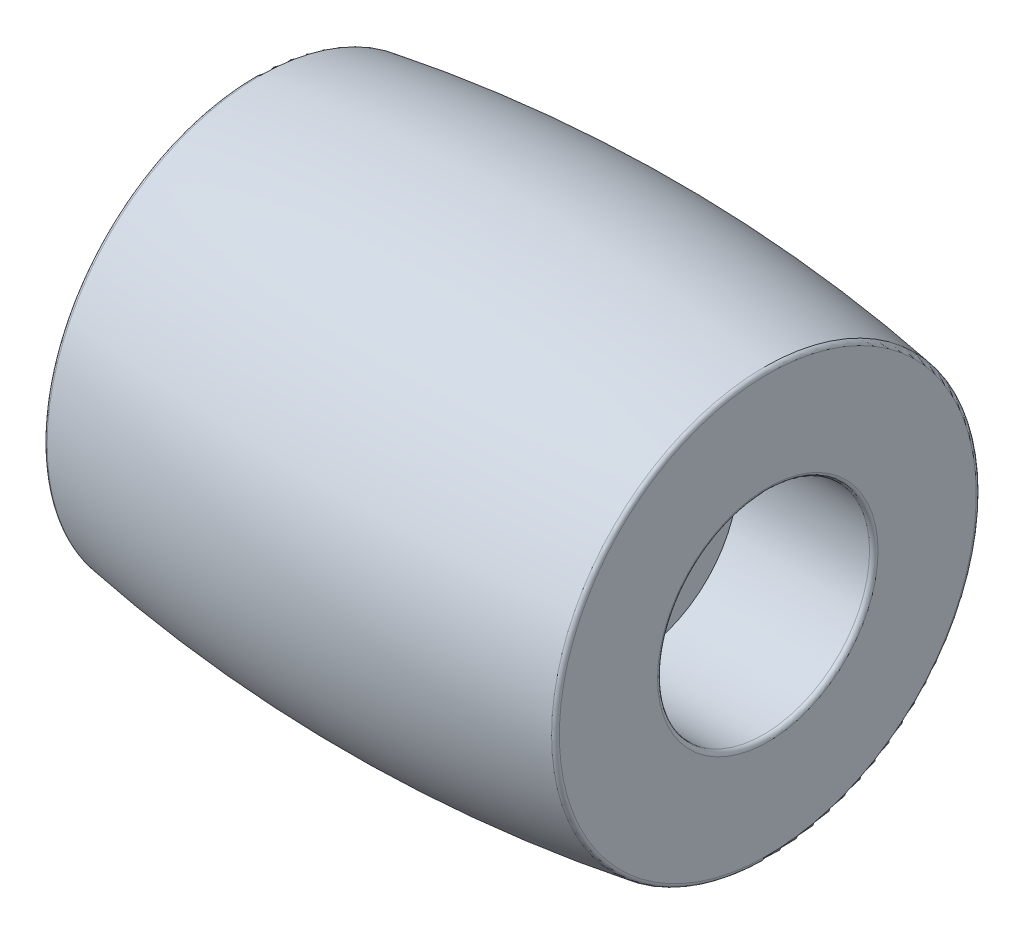
ISO-10303-21;
HEADER;
FILE_DESCRIPTION(('STEP AP214'),'2;1');
FILE_NAME('part.step','',(''),(''),'','','');
FILE_SCHEMA(('AUTOMOTIVE_DESIGN { 1 0 10303 214 1 1 1 1 }'));
ENDSEC;
DATA;
#1=APPLICATION_CONTEXT('core data for automotive mechanical design processes');
#2=APPLICATION_PROTOCOL_DEFINITION('international standard','automotive_design',2000,#1);
#3=PRODUCT_CONTEXT('',#1,'mechanical');
#4=PRODUCT('Part','Part','',(#3));
#5=PRODUCT_RELATED_PRODUCT_CATEGORY('part','',(#4));
#6=PRODUCT_DEFINITION_FORMATION('','',#4);
#7=PRODUCT_DEFINITION_CONTEXT('part definition',#1,'design');
#8=PRODUCT_DEFINITION('design','',#6,#7);
#9=PRODUCT_DEFINITION_SHAPE('','',#8);
#10=(LENGTH_UNIT() NAMED_UNIT(*) SI_UNIT(.MILLI.,.METRE.));
#11=(NAMED_UNIT(*) PLANE_ANGLE_UNIT() SI_UNIT($,.RADIAN.));
#12=(NAMED_UNIT(*) SI_UNIT($,.STERADIAN.) SOLID_ANGLE_UNIT());
#13=UNCERTAINTY_MEASURE_WITH_UNIT(LENGTH_MEASURE(1.E-05),#10,'distance_accuracy_value','');
#14=(GEOMETRIC_REPRESENTATION_CONTEXT(3) GLOBAL_UNCERTAINTY_ASSIGNED_CONTEXT((#13)) GLOBAL_UNIT_ASSIGNED_CONTEXT((#10,
#11,#12)) REPRESENTATION_CONTEXT('',''));
#15=CARTESIAN_POINT('',(0.,0.,0.));
#16=DIRECTION('',(0.,0.,1.));
#17=DIRECTION('',(1.,0.,0.));
#18=AXIS2_PLACEMENT_3D('',#15,#16,#17);
#19=CARTESIAN_POINT('',(-6.03383220595554,32.0092181245626,22.));
#20=DIRECTION('',(-1.,0.,0.));
#21=DIRECTION('',(0.,0.,1.));
#22=AXIS2_PLACEMENT_3D('',#19,#20,#21);
#23=CYLINDRICAL_SURFACE('',#22,1.49999999999977);
#24=CARTESIAN_POINT('',(2.83383220595554,32.0092181245626,22.));
#25=DIRECTION('',(1.,0.,0.));
#26=DIRECTION('',(0.,0.,-1.));
#27=AXIS2_PLACEMENT_3D('',#24,#25,#26);
#28=CIRCLE('',#27,1.49999999999977);
#29=CARTESIAN_POINT('',(2.83383220595554,32.0092181245626,20.5000000000002));
#30=VERTEX_POINT('',#29);
#31=EDGE_CURVE('E61',#30,#30,#28,.T.);
#32=ORIENTED_EDGE('',*,*,#31,.T.);
#33=EDGE_LOOP('',(#32));
#34=FACE_BOUND('',#33,.T.);
#35=CARTESIAN_POINT('',(-2.83383220595554,32.0092181245626,22.));
#36=DIRECTION('',(-1.,0.,0.));
#37=DIRECTION('',(0.,0.,1.));
#38=AXIS2_PLACEMENT_3D('',#35,#36,#37);
#39=CIRCLE('',#38,1.49999999999977);
#40=CARTESIAN_POINT('',(-2.83383220595554,32.0092181245626,23.4999999999998));
#41=VERTEX_POINT('',#40);
#42=EDGE_CURVE('E47',#41,#41,#39,.T.);
#43=ORIENTED_EDGE('',*,*,#42,.T.);
#44=EDGE_LOOP('',(#43));
#45=FACE_BOUND('',#44,.T.);
#46=ADVANCED_FACE('F43',(#34,#45),#23,.F.);
#47=CARTESIAN_POINT('',(0.,32.0092181245626,22.));
#48=DIRECTION('',(-1.,0.,0.));
#49=DIRECTION('',(0.,0.,1.));
#50=AXIS2_PLACEMENT_3D('',#47,#48,#49);
#51=DEGENERATE_TOROIDAL_SURFACE('',#50,32.0092181245621,37.4999999999995,.F.);
#52=CARTESIAN_POINT('',(-5.94969806746879,32.0092181245626,22.));
#53=DIRECTION('',(1.,0.,0.));
#54=DIRECTION('',(0.,0.,-1.));
#55=AXIS2_PLACEMENT_3D('',#52,#53,#54);
#56=CIRCLE('',#55,5.01578819422089);
#57=CARTESIAN_POINT('',(-5.94969806746879,32.0092181245626,16.9842118057791));
#58=VERTEX_POINT('',#57);
#59=EDGE_CURVE('E10',#58,#58,#56,.T.);
#60=ORIENTED_EDGE('',*,*,#59,.T.);
#61=EDGE_LOOP('',(#60));
#62=FACE_BOUND('',#61,.T.);
#63=CARTESIAN_POINT('',(5.94969806746879,32.0092181245626,22.));
#64=DIRECTION('',(-1.,0.,0.));
#65=DIRECTION('',(0.,0.,1.));
#66=AXIS2_PLACEMENT_3D('',#63,#64,#65);
#67=CIRCLE('',#66,5.01578819422089);
#68=CARTESIAN_POINT('',(5.94969806746879,32.0092181245626,27.0157881942209));
#69=VERTEX_POINT('',#68);
#70=EDGE_CURVE('E52',#69,#69,#67,.T.);
#71=ORIENTED_EDGE('',*,*,#70,.T.);
#72=EDGE_LOOP('',(#71));
#73=FACE_BOUND('',#72,.T.);
#74=ADVANCED_FACE('F132',(#62,#73),#51,.F.);
#75=CARTESIAN_POINT('',(-6.03383220595554,0.,22.));
#76=DIRECTION('',(1.,0.,0.));
#77=DIRECTION('',(0.,0.,-1.));
#78=AXIS2_PLACEMENT_3D('',#75,#76,#77);
#79=PLANE('',#78);
#80=CARTESIAN_POINT('',(-6.03383220595554,32.0092181245626,22.));
#81=DIRECTION('',(1.,0.,0.));
#82=DIRECTION('',(0.,0.,-1.));
#83=AXIS2_PLACEMENT_3D('',#80,#81,#82);
#84=CIRCLE('',#83,2.59999999999997);
#85=CARTESIAN_POINT('',(-6.03383220595554,32.0092181245626,19.4));
#86=VERTEX_POINT('',#85);
#87=EDGE_CURVE('E58',#86,#86,#84,.T.);
#88=ORIENTED_EDGE('',*,*,#87,.T.);
#89=EDGE_LOOP('',(#88));
#90=FACE_BOUND('',#89,.T.);
#91=CARTESIAN_POINT('',(-6.03383220595554,32.0092181245626,22.));
#92=DIRECTION('',(1.,0.,0.));
#93=DIRECTION('',(0.,0.,-1.));
#94=AXIS2_PLACEMENT_3D('',#91,#92,#93);
#95=CIRCLE('',#94,4.91705484403746);
#96=CARTESIAN_POINT('',(-6.03383220595554,32.0092181245626,17.0829451559625));
#97=VERTEX_POINT('',#96);
#98=EDGE_CURVE('E93',#97,#97,#95,.F.);
#99=ORIENTED_EDGE('',*,*,#98,.T.);
#100=EDGE_LOOP('',(#99));
#101=FACE_BOUND('',#100,.T.);
#102=ADVANCED_FACE('F100',(#90,#101),#79,.F.);
#103=CARTESIAN_POINT('',(-6.03383220595554,32.0092181245626,22.));
#104=DIRECTION('',(-1.,0.,0.));
#105=DIRECTION('',(0.,0.,1.));
#106=AXIS2_PLACEMENT_3D('',#103,#104,#105);
#107=CYLINDRICAL_SURFACE('',#106,2.49999999999997);
#108=CARTESIAN_POINT('',(-5.93383220595554,32.0092181245626,22.));
#109=DIRECTION('',(1.,0.,0.));
#110=DIRECTION('',(0.,0.,-1.));
#111=AXIS2_PLACEMENT_3D('',#108,#109,#110);
#112=CIRCLE('',#111,2.49999999999997);
#113=CARTESIAN_POINT('',(-5.93383220595554,32.0092181245626,19.5));
#114=VERTEX_POINT('',#113);
#115=EDGE_CURVE('E89',#114,#114,#112,.F.);
#116=ORIENTED_EDGE('',*,*,#115,.T.);
#117=EDGE_LOOP('',(#116));
#118=FACE_BOUND('',#117,.T.);
#119=CARTESIAN_POINT('',(-2.83383220595554,32.0092181245626,22.));
#120=DIRECTION('',(-1.,0.,0.));
#121=DIRECTION('',(0.,0.,1.));
#122=AXIS2_PLACEMENT_3D('',#119,#120,#121);
#123=CIRCLE('',#122,2.49999999999997);
#124=CARTESIAN_POINT('',(-2.83383220595554,32.0092181245626,24.5));
#125=VERTEX_POINT('',#124);
#126=EDGE_CURVE('E79',#125,#125,#123,.T.);
#127=ORIENTED_EDGE('',*,*,#126,.F.);
#128=EDGE_LOOP('',(#127));
#129=FACE_BOUND('',#128,.T.);
#130=ADVANCED_FACE('F111',(#118,#129),#107,.F.);
#131=CARTESIAN_POINT('',(-6.03383220595554,32.0092181245626,22.));
#132=DIRECTION('',(-1.,0.,0.));
#133=DIRECTION('',(0.,0.,1.));
#134=AXIS2_PLACEMENT_3D('',#131,#132,#133);
#135=CYLINDRICAL_SURFACE('',#134,2.49999999999997);
#136=CARTESIAN_POINT('',(5.93383220595554,32.0092181245626,22.));
#137=DIRECTION('',(1.,0.,0.));
#138=DIRECTION('',(0.,0.,-1.));
#139=AXIS2_PLACEMENT_3D('',#136,#137,#138);
#140=CIRCLE('',#139,2.49999999999997);
#141=CARTESIAN_POINT('',(5.93383220595554,32.0092181245626,19.5));
#142=VERTEX_POINT('',#141);
#143=EDGE_CURVE('E85',#142,#142,#140,.T.);
#144=ORIENTED_EDGE('',*,*,#143,.T.);
#145=EDGE_LOOP('',(#144));
#146=FACE_BOUND('',#145,.T.);
#147=CARTESIAN_POINT('',(2.83383220595554,32.0092181245626,22.));
#148=DIRECTION('',(1.,0.,0.));
#149=DIRECTION('',(0.,0.,-1.));
#150=AXIS2_PLACEMENT_3D('',#147,#148,#149);
#151=CIRCLE('',#150,2.49999999999997);
#152=CARTESIAN_POINT('',(2.83383220595554,32.0092181245626,19.5));
#153=VERTEX_POINT('',#152);
#154=EDGE_CURVE('E65',#153,#153,#151,.T.);
#155=ORIENTED_EDGE('',*,*,#154,.F.);
#156=EDGE_LOOP('',(#155));
#157=FACE_BOUND('',#156,.T.);
#158=ADVANCED_FACE('F114',(#146,#157),#135,.F.);
#159=CARTESIAN_POINT('',(6.03383220595554,0.,22.));
#160=DIRECTION('',(1.,0.,0.));
#161=DIRECTION('',(0.,0.,-1.));
#162=AXIS2_PLACEMENT_3D('',#159,#160,#161);
#163=PLANE('',#162);
#164=CARTESIAN_POINT('',(6.03383220595554,32.0092181245626,22.));
#165=DIRECTION('',(1.,0.,0.));
#166=DIRECTION('',(0.,0.,-1.));
#167=AXIS2_PLACEMENT_3D('',#164,#165,#166);
#168=CIRCLE('',#167,2.59999999999997);
#169=CARTESIAN_POINT('',(6.03383220595554,32.0092181245626,19.4));
#170=VERTEX_POINT('',#169);
#171=EDGE_CURVE('E71',#170,#170,#168,.F.);
#172=ORIENTED_EDGE('',*,*,#171,.T.);
#173=EDGE_LOOP('',(#172));
#174=FACE_BOUND('',#173,.T.);
#175=CARTESIAN_POINT('',(6.03383220595554,32.0092181245626,22.));
#176=DIRECTION('',(1.,0.,0.));
#177=DIRECTION('',(0.,0.,-1.));
#178=AXIS2_PLACEMENT_3D('',#175,#176,#177);
#179=CIRCLE('',#178,4.91705484403746);
#180=CARTESIAN_POINT('',(6.03383220595554,32.0092181245626,17.0829451559625));
#181=VERTEX_POINT('',#180);
#182=EDGE_CURVE('E64',#181,#181,#179,.T.);
#183=ORIENTED_EDGE('',*,*,#182,.T.);
#184=EDGE_LOOP('',(#183));
#185=FACE_BOUND('',#184,.T.);
#186=ADVANCED_FACE('F145',(#174,#185),#163,.T.);
#187=CARTESIAN_POINT('',(5.93383220595554,32.0092181245626,22.));
#188=DIRECTION('',(1.,0.,0.));
#189=DIRECTION('',(0.,0.,-1.));
#190=AXIS2_PLACEMENT_3D('',#187,#188,#189);
#191=TOROIDAL_SURFACE('',#190,2.59999999999997,0.1);
#192=ORIENTED_EDGE('',*,*,#143,.F.);
#193=EDGE_LOOP('',(#192));
#194=FACE_BOUND('',#193,.T.);
#195=ORIENTED_EDGE('',*,*,#171,.F.);
#196=EDGE_LOOP('',(#195));
#197=FACE_BOUND('',#196,.T.);
#198=ADVANCED_FACE('F107',(#194,#197),#191,.T.);
#199=CARTESIAN_POINT('',(-5.93383220595554,32.0092181245626,22.));
#200=DIRECTION('',(1.,0.,0.));
#201=DIRECTION('',(0.,0.,-1.));
#202=AXIS2_PLACEMENT_3D('',#199,#200,#201);
#203=TOROIDAL_SURFACE('',#202,2.59999999999997,0.1);
#204=ORIENTED_EDGE('',*,*,#87,.F.);
#205=EDGE_LOOP('',(#204));
#206=FACE_BOUND('',#205,.T.);
#207=ORIENTED_EDGE('',*,*,#115,.F.);
#208=EDGE_LOOP('',(#207));
#209=FACE_BOUND('',#208,.T.);
#210=ADVANCED_FACE('F103',(#206,#209),#203,.T.);
#211=CARTESIAN_POINT('',(-5.93383220595554,32.0092181245626,22.));
#212=DIRECTION('',(1.,0.,0.));
#213=DIRECTION('',(0.,0.,-1.));
#214=AXIS2_PLACEMENT_3D('',#211,#212,#213);
#215=TOROIDAL_SURFACE('',#214,4.91705484403746,0.1);
#216=ORIENTED_EDGE('',*,*,#59,.F.);
#217=EDGE_LOOP('',(#216));
#218=FACE_BOUND('',#217,.T.);
#219=ORIENTED_EDGE('',*,*,#98,.F.);
#220=EDGE_LOOP('',(#219));
#221=FACE_BOUND('',#220,.T.);
#222=ADVANCED_FACE('F106',(#218,#221),#215,.T.);
#223=CARTESIAN_POINT('',(5.93383220595554,32.0092181245626,22.));
#224=DIRECTION('',(1.,0.,0.));
#225=DIRECTION('',(0.,0.,-1.));
#226=AXIS2_PLACEMENT_3D('',#223,#224,#225);
#227=TOROIDAL_SURFACE('',#226,4.91705484403746,0.1);
#228=ORIENTED_EDGE('',*,*,#182,.F.);
#229=EDGE_LOOP('',(#228));
#230=FACE_BOUND('',#229,.T.);
#231=ORIENTED_EDGE('',*,*,#70,.F.);
#232=EDGE_LOOP('',(#231));
#233=FACE_BOUND('',#232,.T.);
#234=ADVANCED_FACE('F45',(#230,#233),#227,.T.);
#235=CARTESIAN_POINT('',(2.83383220595554,32.0092181245626,22.));
#236=DIRECTION('',(1.,0.,0.));
#237=DIRECTION('',(0.,0.,-1.));
#238=AXIS2_PLACEMENT_3D('',#235,#236,#237);
#239=PLANE('',#238);
#240=ORIENTED_EDGE('',*,*,#31,.F.);
#241=EDGE_LOOP('',(#240));
#242=FACE_BOUND('',#241,.T.);
#243=ORIENTED_EDGE('',*,*,#154,.T.);
#244=EDGE_LOOP('',(#243));
#245=FACE_BOUND('',#244,.T.);
#246=ADVANCED_FACE('F122',(#242,#245),#239,.T.);
#247=CARTESIAN_POINT('',(-2.83383220595554,32.0092181245626,22.));
#248=DIRECTION('',(-1.,0.,0.));
#249=DIRECTION('',(0.,0.,1.));
#250=AXIS2_PLACEMENT_3D('',#247,#248,#249);
#251=PLANE('',#250);
#252=ORIENTED_EDGE('',*,*,#42,.F.);
#253=EDGE_LOOP('',(#252));
#254=FACE_BOUND('',#253,.T.);
#255=ORIENTED_EDGE('',*,*,#126,.T.);
#256=EDGE_LOOP('',(#255));
#257=FACE_BOUND('',#256,.T.);
#258=ADVANCED_FACE('F120',(#254,#257),#251,.T.);
#259=CLOSED_SHELL('',(#46,#74,#102,#130,#158,#186,#198,#210,#222,#234,#246,#258));
#260=MANIFOLD_SOLID_BREP('B2',#259);
#261=ADVANCED_BREP_SHAPE_REPRESENTATION('',(#18,#260),#14);
#262=SHAPE_DEFINITION_REPRESENTATION(#9,#261);
ENDSEC;
END-ISO-10303-21;
